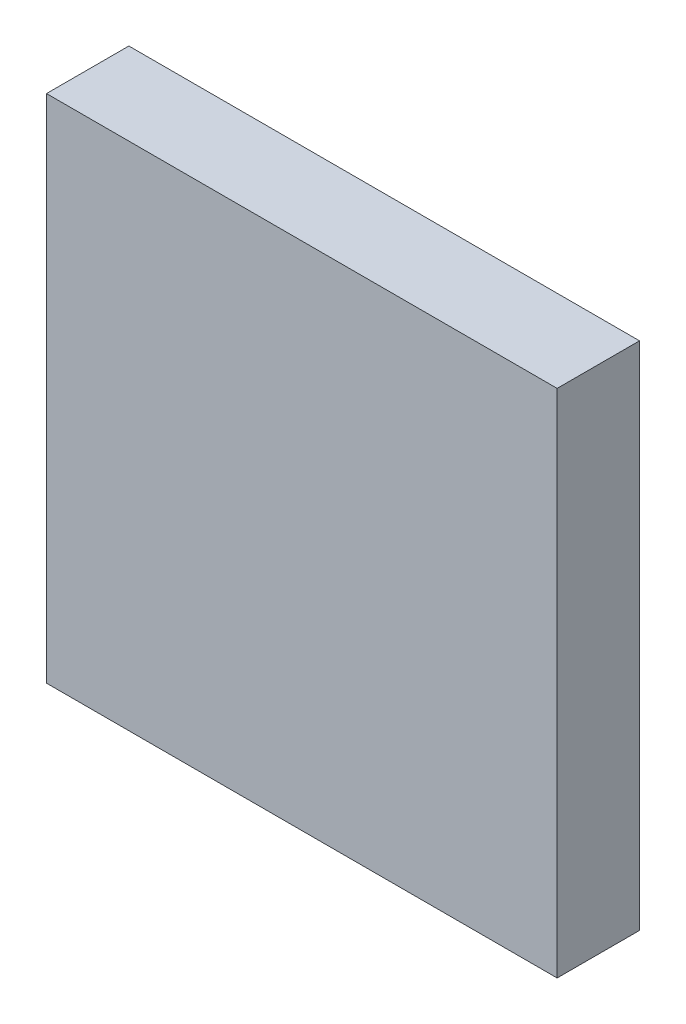
ISO-10303-21;
HEADER;
FILE_DESCRIPTION(('STEP AP214'),'2;1');
FILE_NAME('part.step','',(''),(''),'','','');
FILE_SCHEMA(('AUTOMOTIVE_DESIGN { 1 0 10303 214 1 1 1 1 }'));
ENDSEC;
DATA;
#1=APPLICATION_CONTEXT('core data for automotive mechanical design processes');
#2=APPLICATION_PROTOCOL_DEFINITION('international standard','automotive_design',2000,#1);
#3=PRODUCT_CONTEXT('',#1,'mechanical');
#4=PRODUCT('Part','Part','',(#3));
#5=PRODUCT_RELATED_PRODUCT_CATEGORY('part','',(#4));
#6=PRODUCT_DEFINITION_FORMATION('','',#4);
#7=PRODUCT_DEFINITION_CONTEXT('part definition',#1,'design');
#8=PRODUCT_DEFINITION('design','',#6,#7);
#9=PRODUCT_DEFINITION_SHAPE('','',#8);
#10=(LENGTH_UNIT() NAMED_UNIT(*) SI_UNIT(.MILLI.,.METRE.));
#11=(NAMED_UNIT(*) PLANE_ANGLE_UNIT() SI_UNIT($,.RADIAN.));
#12=(NAMED_UNIT(*) SI_UNIT($,.STERADIAN.) SOLID_ANGLE_UNIT());
#13=UNCERTAINTY_MEASURE_WITH_UNIT(LENGTH_MEASURE(1.E-05),#10,'distance_accuracy_value','');
#14=(GEOMETRIC_REPRESENTATION_CONTEXT(3) GLOBAL_UNCERTAINTY_ASSIGNED_CONTEXT((#13)) GLOBAL_UNIT_ASSIGNED_CONTEXT((#10,
#11,#12)) REPRESENTATION_CONTEXT('',''));
#15=CARTESIAN_POINT('',(0.,0.,0.));
#16=DIRECTION('',(0.,0.,1.));
#17=DIRECTION('',(1.,0.,0.));
#18=AXIS2_PLACEMENT_3D('',#15,#16,#17);
#19=CARTESIAN_POINT('',(-31.,-31.,10.));
#20=DIRECTION('',(0.,1.,0.));
#21=DIRECTION('',(0.,0.,1.));
#22=AXIS2_PLACEMENT_3D('',#19,#20,#21);
#23=PLANE('',#22);
#24=DIRECTION('',(1.,0.,0.));
#25=VECTOR('',#24,1.);
#26=CARTESIAN_POINT('',(-31.,-31.,0.));
#27=LINE('',#26,#25);
#28=CARTESIAN_POINT('',(-31.,-31.,0.));
#29=VERTEX_POINT('',#28);
#30=CARTESIAN_POINT('',(31.,-31.,0.));
#31=VERTEX_POINT('',#30);
#32=EDGE_CURVE('E108',#29,#31,#27,.T.);
#33=ORIENTED_EDGE('',*,*,#32,.T.);
#34=DIRECTION('',(0.,0.,-1.));
#35=VECTOR('',#34,1.);
#36=CARTESIAN_POINT('',(31.,-31.,10.));
#37=LINE('',#36,#35);
#38=CARTESIAN_POINT('',(31.,-31.,10.));
#39=VERTEX_POINT('',#38);
#40=EDGE_CURVE('E11',#39,#31,#37,.T.);
#41=ORIENTED_EDGE('',*,*,#40,.F.);
#42=DIRECTION('',(1.,0.,0.));
#43=VECTOR('',#42,1.);
#44=CARTESIAN_POINT('',(-31.,-31.,10.));
#45=LINE('',#44,#43);
#46=CARTESIAN_POINT('',(-31.,-31.,10.));
#47=VERTEX_POINT('',#46);
#48=EDGE_CURVE('E94',#47,#39,#45,.T.);
#49=ORIENTED_EDGE('',*,*,#48,.F.);
#50=DIRECTION('',(0.,0.,-1.));
#51=VECTOR('',#50,1.);
#52=CARTESIAN_POINT('',(-31.,-31.,10.));
#53=LINE('',#52,#51);
#54=EDGE_CURVE('E61',#47,#29,#53,.T.);
#55=ORIENTED_EDGE('',*,*,#54,.T.);
#56=EDGE_LOOP('',(#33,#41,#49,#55));
#57=FACE_BOUND('',#56,.T.);
#58=ADVANCED_FACE('F45',(#57),#23,.F.);
#59=CARTESIAN_POINT('',(31.,-31.,10.));
#60=DIRECTION('',(-1.,0.,0.));
#61=DIRECTION('',(0.,0.,1.));
#62=AXIS2_PLACEMENT_3D('',#59,#60,#61);
#63=PLANE('',#62);
#64=DIRECTION('',(0.,1.,0.));
#65=VECTOR('',#64,1.);
#66=CARTESIAN_POINT('',(31.,-31.,0.));
#67=LINE('',#66,#65);
#68=CARTESIAN_POINT('',(31.,31.,0.));
#69=VERTEX_POINT('',#68);
#70=EDGE_CURVE('E99',#31,#69,#67,.T.);
#71=ORIENTED_EDGE('',*,*,#70,.T.);
#72=DIRECTION('',(0.,0.,-1.));
#73=VECTOR('',#72,1.);
#74=CARTESIAN_POINT('',(31.,31.,10.));
#75=LINE('',#74,#73);
#76=CARTESIAN_POINT('',(31.,31.,10.));
#77=VERTEX_POINT('',#76);
#78=EDGE_CURVE('E53',#77,#69,#75,.T.);
#79=ORIENTED_EDGE('',*,*,#78,.F.);
#80=DIRECTION('',(0.,1.,0.));
#81=VECTOR('',#80,1.);
#82=CARTESIAN_POINT('',(31.,-31.,10.));
#83=LINE('',#82,#81);
#84=EDGE_CURVE('E86',#39,#77,#83,.T.);
#85=ORIENTED_EDGE('',*,*,#84,.F.);
#86=ORIENTED_EDGE('',*,*,#40,.T.);
#87=EDGE_LOOP('',(#71,#79,#85,#86));
#88=FACE_BOUND('',#87,.T.);
#89=ADVANCED_FACE('F98',(#88),#63,.F.);
#90=CARTESIAN_POINT('',(-31.,31.,10.));
#91=DIRECTION('',(0.,1.,0.));
#92=DIRECTION('',(0.,0.,1.));
#93=AXIS2_PLACEMENT_3D('',#90,#91,#92);
#94=PLANE('',#93);
#95=DIRECTION('',(1.,0.,0.));
#96=VECTOR('',#95,1.);
#97=CARTESIAN_POINT('',(-31.,31.,0.));
#98=LINE('',#97,#96);
#99=CARTESIAN_POINT('',(-31.,31.,0.));
#100=VERTEX_POINT('',#99);
#101=EDGE_CURVE('E111',#100,#69,#98,.T.);
#102=ORIENTED_EDGE('',*,*,#101,.F.);
#103=DIRECTION('',(0.,0.,-1.));
#104=VECTOR('',#103,1.);
#105=CARTESIAN_POINT('',(-31.,31.,10.));
#106=LINE('',#105,#104);
#107=CARTESIAN_POINT('',(-31.,31.,10.));
#108=VERTEX_POINT('',#107);
#109=EDGE_CURVE('E75',#108,#100,#106,.T.);
#110=ORIENTED_EDGE('',*,*,#109,.F.);
#111=DIRECTION('',(1.,0.,0.));
#112=VECTOR('',#111,1.);
#113=CARTESIAN_POINT('',(-31.,31.,10.));
#114=LINE('',#113,#112);
#115=EDGE_CURVE('E93',#108,#77,#114,.T.);
#116=ORIENTED_EDGE('',*,*,#115,.T.);
#117=ORIENTED_EDGE('',*,*,#78,.T.);
#118=EDGE_LOOP('',(#102,#110,#116,#117));
#119=FACE_BOUND('',#118,.T.);
#120=ADVANCED_FACE('F102',(#119),#94,.T.);
#121=CARTESIAN_POINT('',(-31.,-31.,10.));
#122=DIRECTION('',(-1.,0.,0.));
#123=DIRECTION('',(0.,0.,1.));
#124=AXIS2_PLACEMENT_3D('',#121,#122,#123);
#125=PLANE('',#124);
#126=DIRECTION('',(0.,1.,0.));
#127=VECTOR('',#126,1.);
#128=CARTESIAN_POINT('',(-31.,-31.,0.));
#129=LINE('',#128,#127);
#130=EDGE_CURVE('E113',#29,#100,#129,.T.);
#131=ORIENTED_EDGE('',*,*,#130,.F.);
#132=ORIENTED_EDGE('',*,*,#54,.F.);
#133=DIRECTION('',(0.,1.,0.));
#134=VECTOR('',#133,1.);
#135=CARTESIAN_POINT('',(-31.,-31.,10.));
#136=LINE('',#135,#134);
#137=EDGE_CURVE('E103',#47,#108,#136,.T.);
#138=ORIENTED_EDGE('',*,*,#137,.T.);
#139=ORIENTED_EDGE('',*,*,#109,.T.);
#140=EDGE_LOOP('',(#131,#132,#138,#139));
#141=FACE_BOUND('',#140,.T.);
#142=ADVANCED_FACE('F119',(#141),#125,.T.);
#143=CARTESIAN_POINT('',(0.,0.,10.));
#144=DIRECTION('',(0.,0.,1.));
#145=DIRECTION('',(1.,0.,0.));
#146=AXIS2_PLACEMENT_3D('',#143,#144,#145);
#147=PLANE('',#146);
#148=ORIENTED_EDGE('',*,*,#48,.T.);
#149=ORIENTED_EDGE('',*,*,#84,.T.);
#150=ORIENTED_EDGE('',*,*,#115,.F.);
#151=ORIENTED_EDGE('',*,*,#137,.F.);
#152=EDGE_LOOP('',(#148,#149,#150,#151));
#153=FACE_BOUND('',#152,.T.);
#154=ADVANCED_FACE('F90',(#153),#147,.T.);
#155=CARTESIAN_POINT('',(0.,0.,0.));
#156=DIRECTION('',(0.,0.,1.));
#157=DIRECTION('',(1.,0.,0.));
#158=AXIS2_PLACEMENT_3D('',#155,#156,#157);
#159=PLANE('',#158);
#160=ORIENTED_EDGE('',*,*,#32,.F.);
#161=ORIENTED_EDGE('',*,*,#130,.T.);
#162=ORIENTED_EDGE('',*,*,#101,.T.);
#163=ORIENTED_EDGE('',*,*,#70,.F.);
#164=EDGE_LOOP('',(#160,#161,#162,#163));
#165=FACE_BOUND('',#164,.T.);
#166=ADVANCED_FACE('F118',(#165),#159,.F.);
#167=CLOSED_SHELL('',(#58,#89,#120,#142,#154,#166));
#168=MANIFOLD_SOLID_BREP('B2',#167);
#169=ADVANCED_BREP_SHAPE_REPRESENTATION('',(#18,#168),#14);
#170=SHAPE_DEFINITION_REPRESENTATION(#9,#169);
ENDSEC;
END-ISO-10303-21;
